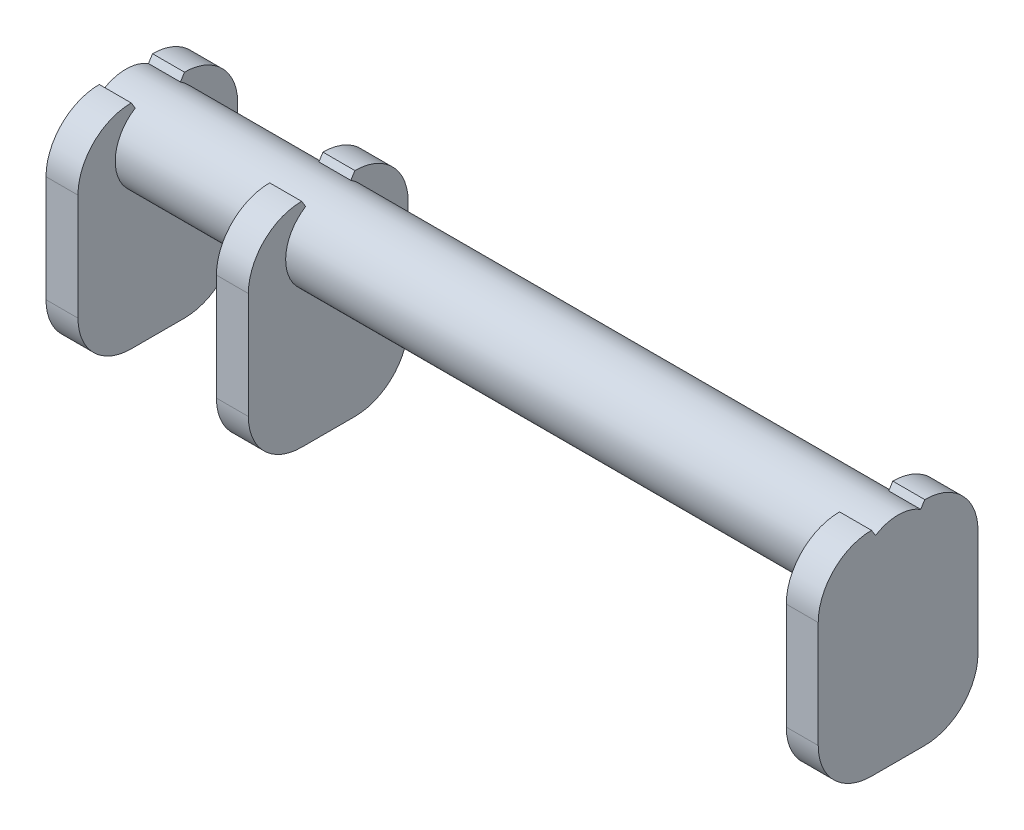
ISO-10303-21;
HEADER;
FILE_DESCRIPTION(('STEP AP214'),'2;1');
FILE_NAME('part.step','',(''),(''),'','','');
FILE_SCHEMA(('AUTOMOTIVE_DESIGN { 1 0 10303 214 1 1 1 1 }'));
ENDSEC;
DATA;
#1=APPLICATION_CONTEXT('core data for automotive mechanical design processes');
#2=APPLICATION_PROTOCOL_DEFINITION('international standard','automotive_design',2000,#1);
#3=PRODUCT_CONTEXT('',#1,'mechanical');
#4=PRODUCT('Part','Part','',(#3));
#5=PRODUCT_RELATED_PRODUCT_CATEGORY('part','',(#4));
#6=PRODUCT_DEFINITION_FORMATION('','',#4);
#7=PRODUCT_DEFINITION_CONTEXT('part definition',#1,'design');
#8=PRODUCT_DEFINITION('design','',#6,#7);
#9=PRODUCT_DEFINITION_SHAPE('','',#8);
#10=(LENGTH_UNIT() NAMED_UNIT(*) SI_UNIT(.MILLI.,.METRE.));
#11=(NAMED_UNIT(*) PLANE_ANGLE_UNIT() SI_UNIT($,.RADIAN.));
#12=(NAMED_UNIT(*) SI_UNIT($,.STERADIAN.) SOLID_ANGLE_UNIT());
#13=UNCERTAINTY_MEASURE_WITH_UNIT(LENGTH_MEASURE(1.E-05),#10,'distance_accuracy_value','');
#14=(GEOMETRIC_REPRESENTATION_CONTEXT(3) GLOBAL_UNCERTAINTY_ASSIGNED_CONTEXT((#13)) GLOBAL_UNIT_ASSIGNED_CONTEXT((#10,
#11,#12)) REPRESENTATION_CONTEXT('',''));
#15=CARTESIAN_POINT('',(0.,0.,0.));
#16=DIRECTION('',(0.,0.,1.));
#17=DIRECTION('',(1.,0.,0.));
#18=AXIS2_PLACEMENT_3D('',#15,#16,#17);
#19=CARTESIAN_POINT('',(145.,0.,0.));
#20=DIRECTION('',(-1.,0.,0.));
#21=DIRECTION('',(0.,0.,1.));
#22=AXIS2_PLACEMENT_3D('',#19,#20,#21);
#23=CYLINDRICAL_SURFACE('',#22,8.);
#24=DIRECTION('',(-1.,0.,0.));
#25=VECTOR('',#24,1.);
#26=CARTESIAN_POINT('',(145.,6.7839864320407,4.23999152002544));
#27=LINE('',#26,#25);
#28=CARTESIAN_POINT('',(38.,6.7839864320407,4.23999152002544));
#29=VERTEX_POINT('',#28);
#30=CARTESIAN_POINT('',(32.,6.7839864320407,4.23999152002544));
#31=VERTEX_POINT('',#30);
#32=EDGE_CURVE('E732',#29,#31,#27,.T.);
#33=ORIENTED_EDGE('',*,*,#32,.F.);
#34=CARTESIAN_POINT('',(38.,0.,0.));
#35=DIRECTION('',(1.,0.,0.));
#36=DIRECTION('',(0.,0.,-1.));
#37=AXIS2_PLACEMENT_3D('',#34,#35,#36);
#38=CIRCLE('',#37,8.);
#39=CARTESIAN_POINT('',(38.,6.78398643204069,-4.23999152002546));
#40=VERTEX_POINT('',#39);
#41=EDGE_CURVE('E180',#29,#40,#38,.T.);
#42=ORIENTED_EDGE('',*,*,#41,.T.);
#43=DIRECTION('',(-1.,0.,0.));
#44=VECTOR('',#43,1.);
#45=CARTESIAN_POINT('',(145.,6.78398643204069,-4.23999152002546));
#46=LINE('',#45,#44);
#47=CARTESIAN_POINT('',(32.,6.78398643204069,-4.23999152002546));
#48=VERTEX_POINT('',#47);
#49=EDGE_CURVE('E398',#40,#48,#46,.T.);
#50=ORIENTED_EDGE('',*,*,#49,.T.);
#51=CARTESIAN_POINT('',(32.,0.,0.));
#52=DIRECTION('',(1.,0.,0.));
#53=DIRECTION('',(0.,0.,-1.));
#54=AXIS2_PLACEMENT_3D('',#51,#52,#53);
#55=CIRCLE('',#54,8.);
#56=EDGE_CURVE('E177',#31,#48,#55,.T.);
#57=ORIENTED_EDGE('',*,*,#56,.F.);
#58=EDGE_LOOP('',(#33,#42,#50,#57));
#59=FACE_BOUND('',#58,.T.);
#60=CARTESIAN_POINT('',(6.00000000000001,6.7839864320407,4.23999152002544));
#61=VERTEX_POINT('',#60);
#62=CARTESIAN_POINT('',(0.,6.7839864320407,4.23999152002544));
#63=VERTEX_POINT('',#62);
#64=EDGE_CURVE('E733',#61,#63,#27,.T.);
#65=ORIENTED_EDGE('',*,*,#64,.F.);
#66=CARTESIAN_POINT('',(6.00000000000001,0.,0.));
#67=DIRECTION('',(1.,0.,0.));
#68=DIRECTION('',(0.,0.,-1.));
#69=AXIS2_PLACEMENT_3D('',#66,#67,#68);
#70=CIRCLE('',#69,8.);
#71=CARTESIAN_POINT('',(6.00000000000001,6.78398643204069,-4.23999152002546));
#72=VERTEX_POINT('',#71);
#73=EDGE_CURVE('E164',#61,#72,#70,.T.);
#74=ORIENTED_EDGE('',*,*,#73,.T.);
#75=CARTESIAN_POINT('',(0.,6.78398643204069,-4.23999152002546));
#76=VERTEX_POINT('',#75);
#77=EDGE_CURVE('E410',#72,#76,#46,.T.);
#78=ORIENTED_EDGE('',*,*,#77,.T.);
#79=CARTESIAN_POINT('',(0.,0.,0.));
#80=DIRECTION('',(1.,0.,0.));
#81=DIRECTION('',(0.,0.,1.));
#82=AXIS2_PLACEMENT_3D('',#79,#80,#81);
#83=CIRCLE('',#82,8.);
#84=EDGE_CURVE('E754',#76,#63,#83,.T.);
#85=ORIENTED_EDGE('',*,*,#84,.T.);
#86=EDGE_LOOP('',(#65,#74,#78,#85));
#87=FACE_BOUND('',#86,.T.);
#88=CARTESIAN_POINT('',(139.,0.,0.));
#89=DIRECTION('',(1.,0.,0.));
#90=DIRECTION('',(0.,0.,-1.));
#91=AXIS2_PLACEMENT_3D('',#88,#89,#90);
#92=CIRCLE('',#91,8.);
#93=CARTESIAN_POINT('',(139.,6.7839864320407,4.23999152002544));
#94=VERTEX_POINT('',#93);
#95=CARTESIAN_POINT('',(139.,6.78398643204069,-4.23999152002546));
#96=VERTEX_POINT('',#95);
#97=EDGE_CURVE('E48',#94,#96,#92,.T.);
#98=ORIENTED_EDGE('',*,*,#97,.F.);
#99=CARTESIAN_POINT('',(145.,6.7839864320407,4.23999152002544));
#100=VERTEX_POINT('',#99);
#101=EDGE_CURVE('E203',#100,#94,#27,.T.);
#102=ORIENTED_EDGE('',*,*,#101,.F.);
#103=CARTESIAN_POINT('',(145.,0.,0.));
#104=DIRECTION('',(1.,0.,0.));
#105=DIRECTION('',(0.,0.,-1.));
#106=AXIS2_PLACEMENT_3D('',#103,#104,#105);
#107=CIRCLE('',#106,8.);
#108=CARTESIAN_POINT('',(145.,6.78398643204069,-4.23999152002547));
#109=VERTEX_POINT('',#108);
#110=EDGE_CURVE('E11',#100,#109,#107,.F.);
#111=ORIENTED_EDGE('',*,*,#110,.T.);
#112=EDGE_CURVE('E205',#109,#96,#46,.T.);
#113=ORIENTED_EDGE('',*,*,#112,.T.);
#114=EDGE_LOOP('',(#98,#102,#111,#113));
#115=FACE_BOUND('',#114,.T.);
#116=ADVANCED_FACE('F41',(#59,#87,#115),#23,.T.);
#117=CARTESIAN_POINT('',(6.,-22.,5.));
#118=DIRECTION('',(-1.,0.,0.));
#119=DIRECTION('',(0.,0.,1.));
#120=AXIS2_PLACEMENT_3D('',#117,#118,#119);
#121=CYLINDRICAL_SURFACE('',#120,10.);
#122=CARTESIAN_POINT('',(0.,-22.,5.));
#123=DIRECTION('',(-1.,0.,0.));
#124=DIRECTION('',(0.,0.,-1.));
#125=AXIS2_PLACEMENT_3D('',#122,#123,#124);
#126=CIRCLE('',#125,10.);
#127=CARTESIAN_POINT('',(0.,-32.,5.));
#128=VERTEX_POINT('',#127);
#129=CARTESIAN_POINT('',(0.,-22.,15.));
#130=VERTEX_POINT('',#129);
#131=EDGE_CURVE('E143',#128,#130,#126,.T.);
#132=ORIENTED_EDGE('',*,*,#131,.F.);
#133=DIRECTION('',(-1.,0.,0.));
#134=VECTOR('',#133,1.);
#135=CARTESIAN_POINT('',(6.,-32.,5.));
#136=LINE('',#135,#134);
#137=CARTESIAN_POINT('',(6.,-32.,5.));
#138=VERTEX_POINT('',#137);
#139=EDGE_CURVE('E62',#138,#128,#136,.T.);
#140=ORIENTED_EDGE('',*,*,#139,.F.);
#141=CARTESIAN_POINT('',(6.,-22.,5.));
#142=DIRECTION('',(-1.,0.,0.));
#143=DIRECTION('',(0.,0.,-1.));
#144=AXIS2_PLACEMENT_3D('',#141,#142,#143);
#145=CIRCLE('',#144,10.);
#146=CARTESIAN_POINT('',(6.,-22.,15.));
#147=VERTEX_POINT('',#146);
#148=EDGE_CURVE('E162',#138,#147,#145,.T.);
#149=ORIENTED_EDGE('',*,*,#148,.T.);
#150=DIRECTION('',(-1.,0.,0.));
#151=VECTOR('',#150,1.);
#152=CARTESIAN_POINT('',(6.,-22.,15.));
#153=LINE('',#152,#151);
#154=EDGE_CURVE('E98',#147,#130,#153,.T.);
#155=ORIENTED_EDGE('',*,*,#154,.T.);
#156=EDGE_LOOP('',(#132,#140,#149,#155));
#157=FACE_BOUND('',#156,.T.);
#158=ADVANCED_FACE('F371',(#157),#121,.T.);
#159=CARTESIAN_POINT('',(6.,-32.,5.));
#160=DIRECTION('',(0.,-1.,0.));
#161=DIRECTION('',(0.,0.,-1.));
#162=AXIS2_PLACEMENT_3D('',#159,#160,#161);
#163=PLANE('',#162);
#164=DIRECTION('',(0.,0.,1.));
#165=VECTOR('',#164,1.);
#166=CARTESIAN_POINT('',(0.,-32.,5.));
#167=LINE('',#166,#165);
#168=CARTESIAN_POINT('',(0.,-32.,-5.));
#169=VERTEX_POINT('',#168);
#170=EDGE_CURVE('E159',#169,#128,#167,.T.);
#171=ORIENTED_EDGE('',*,*,#170,.F.);
#172=DIRECTION('',(-1.,0.,0.));
#173=VECTOR('',#172,1.);
#174=CARTESIAN_POINT('',(6.,-32.,-5.));
#175=LINE('',#174,#173);
#176=CARTESIAN_POINT('',(6.,-32.,-5.));
#177=VERTEX_POINT('',#176);
#178=EDGE_CURVE('E123',#177,#169,#175,.T.);
#179=ORIENTED_EDGE('',*,*,#178,.F.);
#180=DIRECTION('',(0.,0.,1.));
#181=VECTOR('',#180,1.);
#182=CARTESIAN_POINT('',(6.,-32.,5.));
#183=LINE('',#182,#181);
#184=EDGE_CURVE('E133',#177,#138,#183,.T.);
#185=ORIENTED_EDGE('',*,*,#184,.T.);
#186=ORIENTED_EDGE('',*,*,#139,.T.);
#187=EDGE_LOOP('',(#171,#179,#185,#186));
#188=FACE_BOUND('',#187,.T.);
#189=ADVANCED_FACE('F372',(#188),#163,.T.);
#190=CARTESIAN_POINT('',(6.,-22.,-5.));
#191=DIRECTION('',(-1.,0.,0.));
#192=DIRECTION('',(0.,0.,1.));
#193=AXIS2_PLACEMENT_3D('',#190,#191,#192);
#194=CYLINDRICAL_SURFACE('',#193,10.);
#195=CARTESIAN_POINT('',(0.,-22.,-5.));
#196=DIRECTION('',(-1.,0.,0.));
#197=DIRECTION('',(0.,0.,1.));
#198=AXIS2_PLACEMENT_3D('',#195,#196,#197);
#199=CIRCLE('',#198,10.);
#200=CARTESIAN_POINT('',(0.,-22.,-15.));
#201=VERTEX_POINT('',#200);
#202=EDGE_CURVE('E118',#201,#169,#199,.T.);
#203=ORIENTED_EDGE('',*,*,#202,.F.);
#204=DIRECTION('',(-1.,0.,0.));
#205=VECTOR('',#204,1.);
#206=CARTESIAN_POINT('',(6.,-22.,-15.));
#207=LINE('',#206,#205);
#208=CARTESIAN_POINT('',(6.,-22.,-15.));
#209=VERTEX_POINT('',#208);
#210=EDGE_CURVE('E112',#209,#201,#207,.T.);
#211=ORIENTED_EDGE('',*,*,#210,.F.);
#212=CARTESIAN_POINT('',(6.,-22.,-5.));
#213=DIRECTION('',(-1.,0.,0.));
#214=DIRECTION('',(0.,0.,1.));
#215=AXIS2_PLACEMENT_3D('',#212,#213,#214);
#216=CIRCLE('',#215,10.);
#217=EDGE_CURVE('E115',#209,#177,#216,.T.);
#218=ORIENTED_EDGE('',*,*,#217,.T.);
#219=ORIENTED_EDGE('',*,*,#178,.T.);
#220=EDGE_LOOP('',(#203,#211,#218,#219));
#221=FACE_BOUND('',#220,.T.);
#222=ADVANCED_FACE('F114',(#221),#194,.T.);
#223=CARTESIAN_POINT('',(6.,-2.,-15.));
#224=DIRECTION('',(0.,0.,-1.));
#225=DIRECTION('',(0.,1.,0.));
#226=AXIS2_PLACEMENT_3D('',#223,#224,#225);
#227=PLANE('',#226);
#228=DIRECTION('',(0.,-1.,0.));
#229=VECTOR('',#228,1.);
#230=CARTESIAN_POINT('',(0.,-2.,-15.));
#231=LINE('',#230,#229);
#232=CARTESIAN_POINT('',(0.,-2.,-15.));
#233=VERTEX_POINT('',#232);
#234=EDGE_CURVE('E156',#233,#201,#231,.T.);
#235=ORIENTED_EDGE('',*,*,#234,.F.);
#236=DIRECTION('',(-1.,0.,0.));
#237=VECTOR('',#236,1.);
#238=CARTESIAN_POINT('',(6.,-2.,-15.));
#239=LINE('',#238,#237);
#240=CARTESIAN_POINT('',(6.,-2.,-15.));
#241=VERTEX_POINT('',#240);
#242=EDGE_CURVE('E124',#241,#233,#239,.T.);
#243=ORIENTED_EDGE('',*,*,#242,.F.);
#244=DIRECTION('',(0.,-1.,0.));
#245=VECTOR('',#244,1.);
#246=CARTESIAN_POINT('',(6.,-2.,-15.));
#247=LINE('',#246,#245);
#248=EDGE_CURVE('E131',#241,#209,#247,.T.);
#249=ORIENTED_EDGE('',*,*,#248,.T.);
#250=ORIENTED_EDGE('',*,*,#210,.T.);
#251=EDGE_LOOP('',(#235,#243,#249,#250));
#252=FACE_BOUND('',#251,.T.);
#253=ADVANCED_FACE('F135',(#252),#227,.T.);
#254=CARTESIAN_POINT('',(6.,-2.,-5.));
#255=DIRECTION('',(-1.,0.,0.));
#256=DIRECTION('',(0.,0.,1.));
#257=AXIS2_PLACEMENT_3D('',#254,#255,#256);
#258=CYLINDRICAL_SURFACE('',#257,10.);
#259=CARTESIAN_POINT('',(0.,-2.,-5.));
#260=DIRECTION('',(-1.,0.,0.));
#261=DIRECTION('',(0.,0.,1.));
#262=AXIS2_PLACEMENT_3D('',#259,#260,#261);
#263=CIRCLE('',#262,10.);
#264=CARTESIAN_POINT('',(0.,8.,-5.));
#265=VERTEX_POINT('',#264);
#266=EDGE_CURVE('E153',#265,#233,#263,.T.);
#267=ORIENTED_EDGE('',*,*,#266,.F.);
#268=DIRECTION('',(-1.,0.,0.));
#269=VECTOR('',#268,1.);
#270=CARTESIAN_POINT('',(6.,8.,-5.));
#271=LINE('',#270,#269);
#272=CARTESIAN_POINT('',(6.00000000000001,8.,-5.00000000000003));
#273=VERTEX_POINT('',#272);
#274=EDGE_CURVE('E167',#273,#265,#271,.T.);
#275=ORIENTED_EDGE('',*,*,#274,.F.);
#276=CARTESIAN_POINT('',(6.,-2.,-5.));
#277=DIRECTION('',(-1.,0.,0.));
#278=DIRECTION('',(0.,0.,1.));
#279=AXIS2_PLACEMENT_3D('',#276,#277,#278);
#280=CIRCLE('',#279,10.);
#281=EDGE_CURVE('E136',#273,#241,#280,.T.);
#282=ORIENTED_EDGE('',*,*,#281,.T.);
#283=ORIENTED_EDGE('',*,*,#242,.T.);
#284=EDGE_LOOP('',(#267,#275,#282,#283));
#285=FACE_BOUND('',#284,.T.);
#286=ADVANCED_FACE('F380',(#285),#258,.T.);
#287=CARTESIAN_POINT('',(6.,-2.,5.));
#288=DIRECTION('',(-1.,0.,0.));
#289=DIRECTION('',(0.,0.,1.));
#290=AXIS2_PLACEMENT_3D('',#287,#288,#289);
#291=CYLINDRICAL_SURFACE('',#290,10.);
#292=CARTESIAN_POINT('',(0.,-2.,5.));
#293=DIRECTION('',(-1.,0.,0.));
#294=DIRECTION('',(0.,0.,-1.));
#295=AXIS2_PLACEMENT_3D('',#292,#293,#294);
#296=CIRCLE('',#295,10.);
#297=CARTESIAN_POINT('',(0.,-2.,15.));
#298=VERTEX_POINT('',#297);
#299=CARTESIAN_POINT('',(0.,8.,5.));
#300=VERTEX_POINT('',#299);
#301=EDGE_CURVE('E150',#298,#300,#296,.T.);
#302=ORIENTED_EDGE('',*,*,#301,.F.);
#303=DIRECTION('',(-1.,0.,0.));
#304=VECTOR('',#303,1.);
#305=CARTESIAN_POINT('',(6.,-2.,15.));
#306=LINE('',#305,#304);
#307=CARTESIAN_POINT('',(6.,-2.,15.));
#308=VERTEX_POINT('',#307);
#309=EDGE_CURVE('E172',#308,#298,#306,.T.);
#310=ORIENTED_EDGE('',*,*,#309,.F.);
#311=CARTESIAN_POINT('',(6.,-2.,5.));
#312=DIRECTION('',(-1.,0.,0.));
#313=DIRECTION('',(0.,0.,-1.));
#314=AXIS2_PLACEMENT_3D('',#311,#312,#313);
#315=CIRCLE('',#314,10.);
#316=CARTESIAN_POINT('',(6.00000000000001,8.,5.));
#317=VERTEX_POINT('',#316);
#318=EDGE_CURVE('E138',#308,#317,#315,.T.);
#319=ORIENTED_EDGE('',*,*,#318,.T.);
#320=DIRECTION('',(-1.,0.,0.));
#321=VECTOR('',#320,1.);
#322=CARTESIAN_POINT('',(6.,8.,5.));
#323=LINE('',#322,#321);
#324=EDGE_CURVE('E169',#317,#300,#323,.T.);
#325=ORIENTED_EDGE('',*,*,#324,.T.);
#326=EDGE_LOOP('',(#302,#310,#319,#325));
#327=FACE_BOUND('',#326,.T.);
#328=ADVANCED_FACE('F363',(#327),#291,.T.);
#329=CARTESIAN_POINT('',(6.,-2.,15.));
#330=DIRECTION('',(0.,0.,1.));
#331=DIRECTION('',(0.,-1.,0.));
#332=AXIS2_PLACEMENT_3D('',#329,#330,#331);
#333=PLANE('',#332);
#334=DIRECTION('',(0.,1.,0.));
#335=VECTOR('',#334,1.);
#336=CARTESIAN_POINT('',(0.,-2.,15.));
#337=LINE('',#336,#335);
#338=EDGE_CURVE('E146',#130,#298,#337,.T.);
#339=ORIENTED_EDGE('',*,*,#338,.F.);
#340=ORIENTED_EDGE('',*,*,#154,.F.);
#341=DIRECTION('',(0.,1.,0.));
#342=VECTOR('',#341,1.);
#343=CARTESIAN_POINT('',(6.,-2.,15.));
#344=LINE('',#343,#342);
#345=EDGE_CURVE('E358',#147,#308,#344,.T.);
#346=ORIENTED_EDGE('',*,*,#345,.T.);
#347=ORIENTED_EDGE('',*,*,#309,.T.);
#348=EDGE_LOOP('',(#339,#340,#346,#347));
#349=FACE_BOUND('',#348,.T.);
#350=ADVANCED_FACE('F367',(#349),#333,.T.);
#351=CARTESIAN_POINT('',(6.,-22.,5.));
#352=DIRECTION('',(1.,0.,0.));
#353=DIRECTION('',(0.,0.,-1.));
#354=AXIS2_PLACEMENT_3D('',#351,#352,#353);
#355=PLANE('',#354);
#356=DIRECTION('',(0.,-0.847998304005088,-0.52999894000318));
#357=VECTOR('',#356,1.);
#358=CARTESIAN_POINT('',(6.,-13.5730337078652,-8.48314606741573));
#359=LINE('',#358,#357);
#360=EDGE_CURVE('E366',#317,#61,#359,.T.);
#361=ORIENTED_EDGE('',*,*,#360,.F.);
#362=ORIENTED_EDGE('',*,*,#318,.F.);
#363=ORIENTED_EDGE('',*,*,#345,.F.);
#364=ORIENTED_EDGE('',*,*,#148,.F.);
#365=ORIENTED_EDGE('',*,*,#184,.F.);
#366=ORIENTED_EDGE('',*,*,#217,.F.);
#367=ORIENTED_EDGE('',*,*,#248,.F.);
#368=ORIENTED_EDGE('',*,*,#281,.F.);
#369=DIRECTION('',(0.,0.847998304005086,-0.529998940003183));
#370=VECTOR('',#369,1.);
#371=CARTESIAN_POINT('',(6.,-18.067415730337,11.2921348314607));
#372=LINE('',#371,#370);
#373=EDGE_CURVE('E383',#72,#273,#372,.T.);
#374=ORIENTED_EDGE('',*,*,#373,.F.);
#375=ORIENTED_EDGE('',*,*,#73,.F.);
#376=EDGE_LOOP('',(#361,#362,#363,#364,#365,#366,#367,#368,#374,#375));
#377=FACE_BOUND('',#376,.T.);
#378=ADVANCED_FACE('F129',(#377),#355,.T.);
#379=CARTESIAN_POINT('',(0.,0.,0.));
#380=DIRECTION('',(1.,0.,0.));
#381=DIRECTION('',(0.,0.,-1.));
#382=AXIS2_PLACEMENT_3D('',#379,#380,#381);
#383=PLANE('',#382);
#384=ORIENTED_EDGE('',*,*,#301,.T.);
#385=DIRECTION('',(0.,0.847998304005088,0.52999894000318));
#386=VECTOR('',#385,1.);
#387=CARTESIAN_POINT('',(0.,8.,5.));
#388=LINE('',#387,#386);
#389=EDGE_CURVE('E737',#63,#300,#388,.T.);
#390=ORIENTED_EDGE('',*,*,#389,.F.);
#391=ORIENTED_EDGE('',*,*,#84,.F.);
#392=DIRECTION('',(0.,-0.847998304005086,0.529998940003183));
#393=VECTOR('',#392,1.);
#394=CARTESIAN_POINT('',(0.,8.,-5.00000000000003));
#395=LINE('',#394,#393);
#396=EDGE_CURVE('E377',#265,#76,#395,.T.);
#397=ORIENTED_EDGE('',*,*,#396,.F.);
#398=ORIENTED_EDGE('',*,*,#266,.T.);
#399=ORIENTED_EDGE('',*,*,#234,.T.);
#400=ORIENTED_EDGE('',*,*,#202,.T.);
#401=ORIENTED_EDGE('',*,*,#170,.T.);
#402=ORIENTED_EDGE('',*,*,#131,.T.);
#403=ORIENTED_EDGE('',*,*,#338,.T.);
#404=EDGE_LOOP('',(#384,#390,#391,#397,#398,#399,#400,#401,#402,#403));
#405=FACE_BOUND('',#404,.T.);
#406=ADVANCED_FACE('F370',(#405),#383,.F.);
#407=CARTESIAN_POINT('',(38.,-22.,5.));
#408=DIRECTION('',(-1.,0.,0.));
#409=DIRECTION('',(0.,0.,1.));
#410=AXIS2_PLACEMENT_3D('',#407,#408,#409);
#411=CYLINDRICAL_SURFACE('',#410,10.);
#412=CARTESIAN_POINT('',(32.,-22.,5.));
#413=DIRECTION('',(-1.,0.,0.));
#414=DIRECTION('',(0.,0.,-1.));
#415=AXIS2_PLACEMENT_3D('',#412,#413,#414);
#416=CIRCLE('',#415,10.);
#417=CARTESIAN_POINT('',(32.,-32.,5.));
#418=VERTEX_POINT('',#417);
#419=CARTESIAN_POINT('',(32.,-22.,15.));
#420=VERTEX_POINT('',#419);
#421=EDGE_CURVE('E323',#418,#420,#416,.T.);
#422=ORIENTED_EDGE('',*,*,#421,.F.);
#423=DIRECTION('',(-1.,0.,0.));
#424=VECTOR('',#423,1.);
#425=CARTESIAN_POINT('',(38.,-32.,5.));
#426=LINE('',#425,#424);
#427=CARTESIAN_POINT('',(38.,-32.,5.));
#428=VERTEX_POINT('',#427);
#429=EDGE_CURVE('E147',#428,#418,#426,.T.);
#430=ORIENTED_EDGE('',*,*,#429,.F.);
#431=CARTESIAN_POINT('',(38.,-22.,5.));
#432=DIRECTION('',(-1.,0.,0.));
#433=DIRECTION('',(0.,0.,-1.));
#434=AXIS2_PLACEMENT_3D('',#431,#432,#433);
#435=CIRCLE('',#434,10.);
#436=CARTESIAN_POINT('',(38.,-22.,15.));
#437=VERTEX_POINT('',#436);
#438=EDGE_CURVE('E336',#428,#437,#435,.T.);
#439=ORIENTED_EDGE('',*,*,#438,.T.);
#440=DIRECTION('',(-1.,0.,0.));
#441=VECTOR('',#440,1.);
#442=CARTESIAN_POINT('',(38.,-22.,15.));
#443=LINE('',#442,#441);
#444=EDGE_CURVE('E325',#437,#420,#443,.T.);
#445=ORIENTED_EDGE('',*,*,#444,.T.);
#446=EDGE_LOOP('',(#422,#430,#439,#445));
#447=FACE_BOUND('',#446,.T.);
#448=ADVANCED_FACE('F324',(#447),#411,.T.);
#449=CARTESIAN_POINT('',(38.,-32.,5.));
#450=DIRECTION('',(0.,-1.,0.));
#451=DIRECTION('',(0.,0.,-1.));
#452=AXIS2_PLACEMENT_3D('',#449,#450,#451);
#453=PLANE('',#452);
#454=DIRECTION('',(0.,0.,1.));
#455=VECTOR('',#454,1.);
#456=CARTESIAN_POINT('',(32.,-32.,5.));
#457=LINE('',#456,#455);
#458=CARTESIAN_POINT('',(32.,-32.,-5.));
#459=VERTEX_POINT('',#458);
#460=EDGE_CURVE('E315',#459,#418,#457,.T.);
#461=ORIENTED_EDGE('',*,*,#460,.F.);
#462=DIRECTION('',(-1.,0.,0.));
#463=VECTOR('',#462,1.);
#464=CARTESIAN_POINT('',(38.,-32.,-5.));
#465=LINE('',#464,#463);
#466=CARTESIAN_POINT('',(38.,-32.,-5.));
#467=VERTEX_POINT('',#466);
#468=EDGE_CURVE('E306',#467,#459,#465,.T.);
#469=ORIENTED_EDGE('',*,*,#468,.F.);
#470=DIRECTION('',(0.,0.,1.));
#471=VECTOR('',#470,1.);
#472=CARTESIAN_POINT('',(38.,-32.,5.));
#473=LINE('',#472,#471);
#474=EDGE_CURVE('E317',#467,#428,#473,.T.);
#475=ORIENTED_EDGE('',*,*,#474,.T.);
#476=ORIENTED_EDGE('',*,*,#429,.T.);
#477=EDGE_LOOP('',(#461,#469,#475,#476));
#478=FACE_BOUND('',#477,.T.);
#479=ADVANCED_FACE('F313',(#478),#453,.T.);
#480=CARTESIAN_POINT('',(38.,-22.,-5.));
#481=DIRECTION('',(-1.,0.,0.));
#482=DIRECTION('',(0.,0.,1.));
#483=AXIS2_PLACEMENT_3D('',#480,#481,#482);
#484=CYLINDRICAL_SURFACE('',#483,10.);
#485=CARTESIAN_POINT('',(32.,-22.,-5.));
#486=DIRECTION('',(-1.,0.,0.));
#487=DIRECTION('',(0.,0.,1.));
#488=AXIS2_PLACEMENT_3D('',#485,#486,#487);
#489=CIRCLE('',#488,10.);
#490=CARTESIAN_POINT('',(32.,-22.,-15.));
#491=VERTEX_POINT('',#490);
#492=EDGE_CURVE('E335',#491,#459,#489,.T.);
#493=ORIENTED_EDGE('',*,*,#492,.F.);
#494=DIRECTION('',(-1.,0.,0.));
#495=VECTOR('',#494,1.);
#496=CARTESIAN_POINT('',(38.,-22.,-15.));
#497=LINE('',#496,#495);
#498=CARTESIAN_POINT('',(38.,-22.,-15.));
#499=VERTEX_POINT('',#498);
#500=EDGE_CURVE('E345',#499,#491,#497,.T.);
#501=ORIENTED_EDGE('',*,*,#500,.F.);
#502=CARTESIAN_POINT('',(38.,-22.,-5.));
#503=DIRECTION('',(-1.,0.,0.));
#504=DIRECTION('',(0.,0.,1.));
#505=AXIS2_PLACEMENT_3D('',#502,#503,#504);
#506=CIRCLE('',#505,10.);
#507=EDGE_CURVE('E492',#499,#467,#506,.T.);
#508=ORIENTED_EDGE('',*,*,#507,.T.);
#509=ORIENTED_EDGE('',*,*,#468,.T.);
#510=EDGE_LOOP('',(#493,#501,#508,#509));
#511=FACE_BOUND('',#510,.T.);
#512=ADVANCED_FACE('F503',(#511),#484,.T.);
#513=CARTESIAN_POINT('',(38.,-2.,-15.));
#514=DIRECTION('',(0.,0.,-1.));
#515=DIRECTION('',(0.,1.,0.));
#516=AXIS2_PLACEMENT_3D('',#513,#514,#515);
#517=PLANE('',#516);
#518=DIRECTION('',(0.,-1.,0.));
#519=VECTOR('',#518,1.);
#520=CARTESIAN_POINT('',(32.,-2.,-15.));
#521=LINE('',#520,#519);
#522=CARTESIAN_POINT('',(32.,-2.,-15.));
#523=VERTEX_POINT('',#522);
#524=EDGE_CURVE('E340',#523,#491,#521,.T.);
#525=ORIENTED_EDGE('',*,*,#524,.F.);
#526=DIRECTION('',(-1.,0.,0.));
#527=VECTOR('',#526,1.);
#528=CARTESIAN_POINT('',(38.,-2.,-15.));
#529=LINE('',#528,#527);
#530=CARTESIAN_POINT('',(38.,-2.,-15.));
#531=VERTEX_POINT('',#530);
#532=EDGE_CURVE('E347',#531,#523,#529,.T.);
#533=ORIENTED_EDGE('',*,*,#532,.F.);
#534=DIRECTION('',(0.,-1.,0.));
#535=VECTOR('',#534,1.);
#536=CARTESIAN_POINT('',(38.,-2.,-15.));
#537=LINE('',#536,#535);
#538=EDGE_CURVE('E489',#531,#499,#537,.T.);
#539=ORIENTED_EDGE('',*,*,#538,.T.);
#540=ORIENTED_EDGE('',*,*,#500,.T.);
#541=EDGE_LOOP('',(#525,#533,#539,#540));
#542=FACE_BOUND('',#541,.T.);
#543=ADVANCED_FACE('F500',(#542),#517,.T.);
#544=CARTESIAN_POINT('',(38.,-2.,-5.));
#545=DIRECTION('',(-1.,0.,0.));
#546=DIRECTION('',(0.,0.,1.));
#547=AXIS2_PLACEMENT_3D('',#544,#545,#546);
#548=CYLINDRICAL_SURFACE('',#547,10.);
#549=CARTESIAN_POINT('',(32.,-2.,-5.));
#550=DIRECTION('',(-1.,0.,0.));
#551=DIRECTION('',(0.,0.,1.));
#552=AXIS2_PLACEMENT_3D('',#549,#550,#551);
#553=CIRCLE('',#552,10.);
#554=CARTESIAN_POINT('',(32.,8.,-5.));
#555=VERTEX_POINT('',#554);
#556=EDGE_CURVE('E497',#555,#523,#553,.T.);
#557=ORIENTED_EDGE('',*,*,#556,.F.);
#558=DIRECTION('',(-1.,0.,0.));
#559=VECTOR('',#558,1.);
#560=CARTESIAN_POINT('',(38.,8.,-5.));
#561=LINE('',#560,#559);
#562=CARTESIAN_POINT('',(38.,8.,-5.00000000000003));
#563=VERTEX_POINT('',#562);
#564=EDGE_CURVE('E349',#563,#555,#561,.T.);
#565=ORIENTED_EDGE('',*,*,#564,.F.);
#566=CARTESIAN_POINT('',(38.,-2.,-5.));
#567=DIRECTION('',(-1.,0.,0.));
#568=DIRECTION('',(0.,0.,1.));
#569=AXIS2_PLACEMENT_3D('',#566,#567,#568);
#570=CIRCLE('',#569,10.);
#571=EDGE_CURVE('E486',#563,#531,#570,.T.);
#572=ORIENTED_EDGE('',*,*,#571,.T.);
#573=ORIENTED_EDGE('',*,*,#532,.T.);
#574=EDGE_LOOP('',(#557,#565,#572,#573));
#575=FACE_BOUND('',#574,.T.);
#576=ADVANCED_FACE('F510',(#575),#548,.T.);
#577=CARTESIAN_POINT('',(38.,-2.,5.));
#578=DIRECTION('',(-1.,0.,0.));
#579=DIRECTION('',(0.,0.,1.));
#580=AXIS2_PLACEMENT_3D('',#577,#578,#579);
#581=CYLINDRICAL_SURFACE('',#580,10.);
#582=CARTESIAN_POINT('',(32.,-2.,5.));
#583=DIRECTION('',(-1.,0.,0.));
#584=DIRECTION('',(0.,0.,-1.));
#585=AXIS2_PLACEMENT_3D('',#582,#583,#584);
#586=CIRCLE('',#585,10.);
#587=CARTESIAN_POINT('',(32.,-2.,15.));
#588=VERTEX_POINT('',#587);
#589=CARTESIAN_POINT('',(32.,8.,5.));
#590=VERTEX_POINT('',#589);
#591=EDGE_CURVE('E415',#588,#590,#586,.T.);
#592=ORIENTED_EDGE('',*,*,#591,.F.);
#593=DIRECTION('',(-1.,0.,0.));
#594=VECTOR('',#593,1.);
#595=CARTESIAN_POINT('',(38.,-2.,15.));
#596=LINE('',#595,#594);
#597=CARTESIAN_POINT('',(38.,-2.,15.));
#598=VERTEX_POINT('',#597);
#599=EDGE_CURVE('E354',#598,#588,#596,.T.);
#600=ORIENTED_EDGE('',*,*,#599,.F.);
#601=CARTESIAN_POINT('',(38.,-2.,5.));
#602=DIRECTION('',(-1.,0.,0.));
#603=DIRECTION('',(0.,0.,-1.));
#604=AXIS2_PLACEMENT_3D('',#601,#602,#603);
#605=CIRCLE('',#604,10.);
#606=CARTESIAN_POINT('',(38.,8.,5.));
#607=VERTEX_POINT('',#606);
#608=EDGE_CURVE('E483',#598,#607,#605,.T.);
#609=ORIENTED_EDGE('',*,*,#608,.T.);
#610=DIRECTION('',(-1.,0.,0.));
#611=VECTOR('',#610,1.);
#612=CARTESIAN_POINT('',(38.,8.,5.));
#613=LINE('',#612,#611);
#614=EDGE_CURVE('E351',#607,#590,#613,.T.);
#615=ORIENTED_EDGE('',*,*,#614,.T.);
#616=EDGE_LOOP('',(#592,#600,#609,#615));
#617=FACE_BOUND('',#616,.T.);
#618=ADVANCED_FACE('F706',(#617),#581,.T.);
#619=CARTESIAN_POINT('',(38.,-2.,15.));
#620=DIRECTION('',(0.,0.,1.));
#621=DIRECTION('',(0.,-1.,0.));
#622=AXIS2_PLACEMENT_3D('',#619,#620,#621);
#623=PLANE('',#622);
#624=DIRECTION('',(0.,1.,0.));
#625=VECTOR('',#624,1.);
#626=CARTESIAN_POINT('',(32.,-2.,15.));
#627=LINE('',#626,#625);
#628=EDGE_CURVE('E329',#420,#588,#627,.T.);
#629=ORIENTED_EDGE('',*,*,#628,.F.);
#630=ORIENTED_EDGE('',*,*,#444,.F.);
#631=DIRECTION('',(0.,1.,0.));
#632=VECTOR('',#631,1.);
#633=CARTESIAN_POINT('',(38.,-2.,15.));
#634=LINE('',#633,#632);
#635=EDGE_CURVE('E338',#437,#598,#634,.T.);
#636=ORIENTED_EDGE('',*,*,#635,.T.);
#637=ORIENTED_EDGE('',*,*,#599,.T.);
#638=EDGE_LOOP('',(#629,#630,#636,#637));
#639=FACE_BOUND('',#638,.T.);
#640=ADVANCED_FACE('F665',(#639),#623,.T.);
#641=CARTESIAN_POINT('',(38.,-22.,5.));
#642=DIRECTION('',(1.,0.,0.));
#643=DIRECTION('',(0.,0.,-1.));
#644=AXIS2_PLACEMENT_3D('',#641,#642,#643);
#645=PLANE('',#644);
#646=DIRECTION('',(0.,-0.847998304005088,-0.52999894000318));
#647=VECTOR('',#646,1.);
#648=CARTESIAN_POINT('',(38.,-13.5730337078652,-8.48314606741573));
#649=LINE('',#648,#647);
#650=EDGE_CURVE('E417',#607,#29,#649,.T.);
#651=ORIENTED_EDGE('',*,*,#650,.F.);
#652=ORIENTED_EDGE('',*,*,#608,.F.);
#653=ORIENTED_EDGE('',*,*,#635,.F.);
#654=ORIENTED_EDGE('',*,*,#438,.F.);
#655=ORIENTED_EDGE('',*,*,#474,.F.);
#656=ORIENTED_EDGE('',*,*,#507,.F.);
#657=ORIENTED_EDGE('',*,*,#538,.F.);
#658=ORIENTED_EDGE('',*,*,#571,.F.);
#659=DIRECTION('',(0.,0.847998304005086,-0.529998940003183));
#660=VECTOR('',#659,1.);
#661=CARTESIAN_POINT('',(38.,-18.067415730337,11.2921348314607));
#662=LINE('',#661,#660);
#663=EDGE_CURVE('E403',#40,#563,#662,.T.);
#664=ORIENTED_EDGE('',*,*,#663,.F.);
#665=ORIENTED_EDGE('',*,*,#41,.F.);
#666=EDGE_LOOP('',(#651,#652,#653,#654,#655,#656,#657,#658,#664,#665));
#667=FACE_BOUND('',#666,.T.);
#668=ADVANCED_FACE('F662',(#667),#645,.T.);
#669=CARTESIAN_POINT('',(32.,-22.,5.));
#670=DIRECTION('',(1.,0.,0.));
#671=DIRECTION('',(0.,0.,-1.));
#672=AXIS2_PLACEMENT_3D('',#669,#670,#671);
#673=PLANE('',#672);
#674=ORIENTED_EDGE('',*,*,#591,.T.);
#675=DIRECTION('',(0.,-0.847998304005088,-0.52999894000318));
#676=VECTOR('',#675,1.);
#677=CARTESIAN_POINT('',(32.,-13.5730337078652,-8.48314606741573));
#678=LINE('',#677,#676);
#679=EDGE_CURVE('E413',#590,#31,#678,.T.);
#680=ORIENTED_EDGE('',*,*,#679,.T.);
#681=ORIENTED_EDGE('',*,*,#56,.T.);
#682=DIRECTION('',(0.,0.847998304005086,-0.529998940003183));
#683=VECTOR('',#682,1.);
#684=CARTESIAN_POINT('',(32.,-18.067415730337,11.2921348314607));
#685=LINE('',#684,#683);
#686=EDGE_CURVE('E395',#48,#555,#685,.T.);
#687=ORIENTED_EDGE('',*,*,#686,.T.);
#688=ORIENTED_EDGE('',*,*,#556,.T.);
#689=ORIENTED_EDGE('',*,*,#524,.T.);
#690=ORIENTED_EDGE('',*,*,#492,.T.);
#691=ORIENTED_EDGE('',*,*,#460,.T.);
#692=ORIENTED_EDGE('',*,*,#421,.T.);
#693=ORIENTED_EDGE('',*,*,#628,.T.);
#694=EDGE_LOOP('',(#674,#680,#681,#687,#688,#689,#690,#691,#692,#693));
#695=FACE_BOUND('',#694,.T.);
#696=ADVANCED_FACE('F333',(#695),#673,.F.);
#697=CARTESIAN_POINT('',(145.,-22.,5.));
#698=DIRECTION('',(-1.,0.,0.));
#699=DIRECTION('',(0.,0.,1.));
#700=AXIS2_PLACEMENT_3D('',#697,#698,#699);
#701=CYLINDRICAL_SURFACE('',#700,10.);
#702=CARTESIAN_POINT('',(139.,-22.,5.));
#703=DIRECTION('',(-1.,0.,0.));
#704=DIRECTION('',(0.,0.,-1.));
#705=AXIS2_PLACEMENT_3D('',#702,#703,#704);
#706=CIRCLE('',#705,10.);
#707=CARTESIAN_POINT('',(139.,-32.,5.));
#708=VERTEX_POINT('',#707);
#709=CARTESIAN_POINT('',(139.,-22.,15.));
#710=VERTEX_POINT('',#709);
#711=EDGE_CURVE('E424',#708,#710,#706,.T.);
#712=ORIENTED_EDGE('',*,*,#711,.F.);
#713=DIRECTION('',(-1.,0.,0.));
#714=VECTOR('',#713,1.);
#715=CARTESIAN_POINT('',(145.,-32.,5.));
#716=LINE('',#715,#714);
#717=CARTESIAN_POINT('',(145.,-32.,5.));
#718=VERTEX_POINT('',#717);
#719=EDGE_CURVE('E330',#718,#708,#716,.T.);
#720=ORIENTED_EDGE('',*,*,#719,.F.);
#721=CARTESIAN_POINT('',(145.,-22.,5.));
#722=DIRECTION('',(-1.,0.,0.));
#723=DIRECTION('',(0.,0.,-1.));
#724=AXIS2_PLACEMENT_3D('',#721,#722,#723);
#725=CIRCLE('',#724,10.);
#726=CARTESIAN_POINT('',(145.,-22.,15.));
#727=VERTEX_POINT('',#726);
#728=EDGE_CURVE('E425',#718,#727,#725,.T.);
#729=ORIENTED_EDGE('',*,*,#728,.T.);
#730=DIRECTION('',(-1.,0.,0.));
#731=VECTOR('',#730,1.);
#732=CARTESIAN_POINT('',(145.,-22.,15.));
#733=LINE('',#732,#731);
#734=EDGE_CURVE('E447',#727,#710,#733,.T.);
#735=ORIENTED_EDGE('',*,*,#734,.T.);
#736=EDGE_LOOP('',(#712,#720,#729,#735));
#737=FACE_BOUND('',#736,.T.);
#738=ADVANCED_FACE('F640',(#737),#701,.T.);
#739=CARTESIAN_POINT('',(145.,-32.,5.));
#740=DIRECTION('',(0.,-1.,0.));
#741=DIRECTION('',(0.,0.,-1.));
#742=AXIS2_PLACEMENT_3D('',#739,#740,#741);
#743=PLANE('',#742);
#744=DIRECTION('',(0.,0.,1.));
#745=VECTOR('',#744,1.);
#746=CARTESIAN_POINT('',(139.,-32.,5.));
#747=LINE('',#746,#745);
#748=CARTESIAN_POINT('',(139.,-32.,-5.));
#749=VERTEX_POINT('',#748);
#750=EDGE_CURVE('E429',#749,#708,#747,.T.);
#751=ORIENTED_EDGE('',*,*,#750,.F.);
#752=DIRECTION('',(-1.,0.,0.));
#753=VECTOR('',#752,1.);
#754=CARTESIAN_POINT('',(145.,-32.,-5.));
#755=LINE('',#754,#753);
#756=CARTESIAN_POINT('',(145.,-32.,-5.));
#757=VERTEX_POINT('',#756);
#758=EDGE_CURVE('E466',#757,#749,#755,.T.);
#759=ORIENTED_EDGE('',*,*,#758,.F.);
#760=DIRECTION('',(0.,0.,1.));
#761=VECTOR('',#760,1.);
#762=CARTESIAN_POINT('',(145.,-32.,5.));
#763=LINE('',#762,#761);
#764=EDGE_CURVE('E444',#757,#718,#763,.T.);
#765=ORIENTED_EDGE('',*,*,#764,.T.);
#766=ORIENTED_EDGE('',*,*,#719,.T.);
#767=EDGE_LOOP('',(#751,#759,#765,#766));
#768=FACE_BOUND('',#767,.T.);
#769=ADVANCED_FACE('F636',(#768),#743,.T.);
#770=CARTESIAN_POINT('',(145.,-22.,-5.));
#771=DIRECTION('',(-1.,0.,0.));
#772=DIRECTION('',(0.,0.,1.));
#773=AXIS2_PLACEMENT_3D('',#770,#771,#772);
#774=CYLINDRICAL_SURFACE('',#773,10.);
#775=CARTESIAN_POINT('',(139.,-22.,-5.));
#776=DIRECTION('',(-1.,0.,0.));
#777=DIRECTION('',(0.,0.,1.));
#778=AXIS2_PLACEMENT_3D('',#775,#776,#777);
#779=CIRCLE('',#778,10.);
#780=CARTESIAN_POINT('',(139.,-22.,-15.));
#781=VERTEX_POINT('',#780);
#782=EDGE_CURVE('E460',#781,#749,#779,.T.);
#783=ORIENTED_EDGE('',*,*,#782,.F.);
#784=DIRECTION('',(-1.,0.,0.));
#785=VECTOR('',#784,1.);
#786=CARTESIAN_POINT('',(145.,-22.,-15.));
#787=LINE('',#786,#785);
#788=CARTESIAN_POINT('',(145.,-22.,-15.));
#789=VERTEX_POINT('',#788);
#790=EDGE_CURVE('E468',#789,#781,#787,.T.);
#791=ORIENTED_EDGE('',*,*,#790,.F.);
#792=CARTESIAN_POINT('',(145.,-22.,-5.));
#793=DIRECTION('',(-1.,0.,0.));
#794=DIRECTION('',(0.,0.,1.));
#795=AXIS2_PLACEMENT_3D('',#792,#793,#794);
#796=CIRCLE('',#795,10.);
#797=EDGE_CURVE('E441',#789,#757,#796,.T.);
#798=ORIENTED_EDGE('',*,*,#797,.T.);
#799=ORIENTED_EDGE('',*,*,#758,.T.);
#800=EDGE_LOOP('',(#783,#791,#798,#799));
#801=FACE_BOUND('',#800,.T.);
#802=ADVANCED_FACE('F639',(#801),#774,.T.);
#803=CARTESIAN_POINT('',(145.,-2.,-15.));
#804=DIRECTION('',(0.,0.,-1.));
#805=DIRECTION('',(0.,1.,0.));
#806=AXIS2_PLACEMENT_3D('',#803,#804,#805);
#807=PLANE('',#806);
#808=DIRECTION('',(0.,-1.,0.));
#809=VECTOR('',#808,1.);
#810=CARTESIAN_POINT('',(139.,-2.,-15.));
#811=LINE('',#810,#809);
#812=CARTESIAN_POINT('',(139.,-2.,-15.));
#813=VERTEX_POINT('',#812);
#814=EDGE_CURVE('E457',#813,#781,#811,.T.);
#815=ORIENTED_EDGE('',*,*,#814,.F.);
#816=DIRECTION('',(-1.,0.,0.));
#817=VECTOR('',#816,1.);
#818=CARTESIAN_POINT('',(145.,-2.,-15.));
#819=LINE('',#818,#817);
#820=CARTESIAN_POINT('',(145.,-2.,-15.));
#821=VERTEX_POINT('',#820);
#822=EDGE_CURVE('E470',#821,#813,#819,.T.);
#823=ORIENTED_EDGE('',*,*,#822,.F.);
#824=DIRECTION('',(0.,-1.,0.));
#825=VECTOR('',#824,1.);
#826=CARTESIAN_POINT('',(145.,-2.,-15.));
#827=LINE('',#826,#825);
#828=EDGE_CURVE('E438',#821,#789,#827,.T.);
#829=ORIENTED_EDGE('',*,*,#828,.T.);
#830=ORIENTED_EDGE('',*,*,#790,.T.);
#831=EDGE_LOOP('',(#815,#823,#829,#830));
#832=FACE_BOUND('',#831,.T.);
#833=ADVANCED_FACE('F644',(#832),#807,.T.);
#834=CARTESIAN_POINT('',(145.,-2.,-5.));
#835=DIRECTION('',(-1.,0.,0.));
#836=DIRECTION('',(0.,0.,1.));
#837=AXIS2_PLACEMENT_3D('',#834,#835,#836);
#838=CYLINDRICAL_SURFACE('',#837,10.);
#839=CARTESIAN_POINT('',(139.,-2.,-5.));
#840=DIRECTION('',(-1.,0.,0.));
#841=DIRECTION('',(0.,0.,1.));
#842=AXIS2_PLACEMENT_3D('',#839,#840,#841);
#843=CIRCLE('',#842,10.);
#844=CARTESIAN_POINT('',(139.,8.,-5.00000000000003));
#845=VERTEX_POINT('',#844);
#846=EDGE_CURVE('E455',#845,#813,#843,.T.);
#847=ORIENTED_EDGE('',*,*,#846,.F.);
#848=DIRECTION('',(-1.,0.,0.));
#849=VECTOR('',#848,1.);
#850=CARTESIAN_POINT('',(145.,8.,-5.));
#851=LINE('',#850,#849);
#852=CARTESIAN_POINT('',(145.,8.,-5.00000000000003));
#853=VERTEX_POINT('',#852);
#854=EDGE_CURVE('E472',#853,#845,#851,.T.);
#855=ORIENTED_EDGE('',*,*,#854,.F.);
#856=CARTESIAN_POINT('',(145.,-2.,-5.));
#857=DIRECTION('',(-1.,0.,0.));
#858=DIRECTION('',(0.,0.,1.));
#859=AXIS2_PLACEMENT_3D('',#856,#857,#858);
#860=CIRCLE('',#859,10.);
#861=EDGE_CURVE('E435',#853,#821,#860,.T.);
#862=ORIENTED_EDGE('',*,*,#861,.T.);
#863=ORIENTED_EDGE('',*,*,#822,.T.);
#864=EDGE_LOOP('',(#847,#855,#862,#863));
#865=FACE_BOUND('',#864,.T.);
#866=ADVANCED_FACE('F648',(#865),#838,.T.);
#867=CARTESIAN_POINT('',(145.,-2.,5.));
#868=DIRECTION('',(-1.,0.,0.));
#869=DIRECTION('',(0.,0.,1.));
#870=AXIS2_PLACEMENT_3D('',#867,#868,#869);
#871=CYLINDRICAL_SURFACE('',#870,10.);
#872=CARTESIAN_POINT('',(139.,-2.,5.));
#873=DIRECTION('',(-1.,0.,0.));
#874=DIRECTION('',(0.,0.,-1.));
#875=AXIS2_PLACEMENT_3D('',#872,#873,#874);
#876=CIRCLE('',#875,10.);
#877=CARTESIAN_POINT('',(139.,-2.,15.));
#878=VERTEX_POINT('',#877);
#879=CARTESIAN_POINT('',(139.,8.,5.));
#880=VERTEX_POINT('',#879);
#881=EDGE_CURVE('E453',#878,#880,#876,.T.);
#882=ORIENTED_EDGE('',*,*,#881,.F.);
#883=DIRECTION('',(-1.,0.,0.));
#884=VECTOR('',#883,1.);
#885=CARTESIAN_POINT('',(145.,-2.,15.));
#886=LINE('',#885,#884);
#887=CARTESIAN_POINT('',(145.,-2.,15.));
#888=VERTEX_POINT('',#887);
#889=EDGE_CURVE('E478',#888,#878,#886,.T.);
#890=ORIENTED_EDGE('',*,*,#889,.F.);
#891=CARTESIAN_POINT('',(145.,-2.,5.));
#892=DIRECTION('',(-1.,0.,0.));
#893=DIRECTION('',(0.,0.,-1.));
#894=AXIS2_PLACEMENT_3D('',#891,#892,#893);
#895=CIRCLE('',#894,10.);
#896=CARTESIAN_POINT('',(145.,8.,5.));
#897=VERTEX_POINT('',#896);
#898=EDGE_CURVE('E432',#888,#897,#895,.T.);
#899=ORIENTED_EDGE('',*,*,#898,.T.);
#900=DIRECTION('',(-1.,0.,0.));
#901=VECTOR('',#900,1.);
#902=CARTESIAN_POINT('',(145.,8.,5.));
#903=LINE('',#902,#901);
#904=EDGE_CURVE('E475',#897,#880,#903,.T.);
#905=ORIENTED_EDGE('',*,*,#904,.T.);
#906=EDGE_LOOP('',(#882,#890,#899,#905));
#907=FACE_BOUND('',#906,.T.);
#908=ADVANCED_FACE('F652',(#907),#871,.T.);
#909=CARTESIAN_POINT('',(145.,-2.,15.));
#910=DIRECTION('',(0.,0.,1.));
#911=DIRECTION('',(0.,-1.,0.));
#912=AXIS2_PLACEMENT_3D('',#909,#910,#911);
#913=PLANE('',#912);
#914=DIRECTION('',(0.,1.,0.));
#915=VECTOR('',#914,1.);
#916=CARTESIAN_POINT('',(139.,-2.,15.));
#917=LINE('',#916,#915);
#918=EDGE_CURVE('E450',#710,#878,#917,.T.);
#919=ORIENTED_EDGE('',*,*,#918,.F.);
#920=ORIENTED_EDGE('',*,*,#734,.F.);
#921=DIRECTION('',(0.,1.,0.));
#922=VECTOR('',#921,1.);
#923=CARTESIAN_POINT('',(145.,-2.,15.));
#924=LINE('',#923,#922);
#925=EDGE_CURVE('E428',#727,#888,#924,.T.);
#926=ORIENTED_EDGE('',*,*,#925,.T.);
#927=ORIENTED_EDGE('',*,*,#889,.T.);
#928=EDGE_LOOP('',(#919,#920,#926,#927));
#929=FACE_BOUND('',#928,.T.);
#930=ADVANCED_FACE('F635',(#929),#913,.T.);
#931=CARTESIAN_POINT('',(139.,-22.,5.));
#932=DIRECTION('',(1.,0.,0.));
#933=DIRECTION('',(0.,0.,-1.));
#934=AXIS2_PLACEMENT_3D('',#931,#932,#933);
#935=PLANE('',#934);
#936=ORIENTED_EDGE('',*,*,#881,.T.);
#937=DIRECTION('',(0.,-0.847998304005088,-0.52999894000318));
#938=VECTOR('',#937,1.);
#939=CARTESIAN_POINT('',(139.,-13.5730337078652,-8.48314606741573));
#940=LINE('',#939,#938);
#941=EDGE_CURVE('E197',#880,#94,#940,.T.);
#942=ORIENTED_EDGE('',*,*,#941,.T.);
#943=ORIENTED_EDGE('',*,*,#97,.T.);
#944=DIRECTION('',(0.,0.847998304005086,-0.529998940003183));
#945=VECTOR('',#944,1.);
#946=CARTESIAN_POINT('',(139.,-18.067415730337,11.2921348314607));
#947=LINE('',#946,#945);
#948=EDGE_CURVE('E193',#96,#845,#947,.T.);
#949=ORIENTED_EDGE('',*,*,#948,.T.);
#950=ORIENTED_EDGE('',*,*,#846,.T.);
#951=ORIENTED_EDGE('',*,*,#814,.T.);
#952=ORIENTED_EDGE('',*,*,#782,.T.);
#953=ORIENTED_EDGE('',*,*,#750,.T.);
#954=ORIENTED_EDGE('',*,*,#711,.T.);
#955=ORIENTED_EDGE('',*,*,#918,.T.);
#956=EDGE_LOOP('',(#936,#942,#943,#949,#950,#951,#952,#953,#954,#955));
#957=FACE_BOUND('',#956,.T.);
#958=ADVANCED_FACE('F189',(#957),#935,.F.);
#959=CARTESIAN_POINT('',(145.,0.,0.));
#960=DIRECTION('',(1.,0.,0.));
#961=DIRECTION('',(0.,0.,-1.));
#962=AXIS2_PLACEMENT_3D('',#959,#960,#961);
#963=PLANE('',#962);
#964=DIRECTION('',(0.,0.847998304005088,0.52999894000318));
#965=VECTOR('',#964,1.);
#966=CARTESIAN_POINT('',(145.,8.,5.));
#967=LINE('',#966,#965);
#968=EDGE_CURVE('E743',#100,#897,#967,.T.);
#969=ORIENTED_EDGE('',*,*,#968,.T.);
#970=ORIENTED_EDGE('',*,*,#898,.F.);
#971=ORIENTED_EDGE('',*,*,#925,.F.);
#972=ORIENTED_EDGE('',*,*,#728,.F.);
#973=ORIENTED_EDGE('',*,*,#764,.F.);
#974=ORIENTED_EDGE('',*,*,#797,.F.);
#975=ORIENTED_EDGE('',*,*,#828,.F.);
#976=ORIENTED_EDGE('',*,*,#861,.F.);
#977=DIRECTION('',(0.,-0.847998304005086,0.529998940003183));
#978=VECTOR('',#977,1.);
#979=CARTESIAN_POINT('',(145.,8.,-5.00000000000003));
#980=LINE('',#979,#978);
#981=EDGE_CURVE('E747',#853,#109,#980,.T.);
#982=ORIENTED_EDGE('',*,*,#981,.T.);
#983=ORIENTED_EDGE('',*,*,#110,.F.);
#984=EDGE_LOOP('',(#969,#970,#971,#972,#973,#974,#975,#976,#982,#983));
#985=FACE_BOUND('',#984,.T.);
#986=ADVANCED_FACE('F527',(#985),#963,.T.);
#987=CARTESIAN_POINT('',(145.,8.,-5.00000000000003));
#988=DIRECTION('',(0.,-0.529998940003183,-0.847998304005086));
#989=DIRECTION('',(0.,0.847998304005086,-0.529998940003183));
#990=AXIS2_PLACEMENT_3D('',#987,#988,#989);
#991=PLANE('',#990);
#992=ORIENTED_EDGE('',*,*,#112,.F.);
#993=ORIENTED_EDGE('',*,*,#981,.F.);
#994=ORIENTED_EDGE('',*,*,#854,.T.);
#995=ORIENTED_EDGE('',*,*,#948,.F.);
#996=EDGE_LOOP('',(#992,#993,#994,#995));
#997=FACE_BOUND('',#996,.T.);
#998=ADVANCED_FACE('F529',(#997),#991,.F.);
#999=CARTESIAN_POINT('',(145.,8.,5.));
#1000=DIRECTION('',(0.,-0.52999894000318,0.847998304005088));
#1001=DIRECTION('',(0.,-0.847998304005088,-0.52999894000318));
#1002=AXIS2_PLACEMENT_3D('',#999,#1000,#1001);
#1003=PLANE('',#1002);
#1004=ORIENTED_EDGE('',*,*,#904,.F.);
#1005=ORIENTED_EDGE('',*,*,#968,.F.);
#1006=ORIENTED_EDGE('',*,*,#101,.T.);
#1007=ORIENTED_EDGE('',*,*,#941,.F.);
#1008=EDGE_LOOP('',(#1004,#1005,#1006,#1007));
#1009=FACE_BOUND('',#1008,.T.);
#1010=ADVANCED_FACE('F600',(#1009),#1003,.F.);
#1011=ORIENTED_EDGE('',*,*,#663,.T.);
#1012=ORIENTED_EDGE('',*,*,#564,.T.);
#1013=ORIENTED_EDGE('',*,*,#686,.F.);
#1014=ORIENTED_EDGE('',*,*,#49,.F.);
#1015=EDGE_LOOP('',(#1011,#1012,#1013,#1014));
#1016=FACE_BOUND('',#1015,.T.);
#1017=ADVANCED_FACE('F397',(#1016),#991,.F.);
#1018=ORIENTED_EDGE('',*,*,#650,.T.);
#1019=ORIENTED_EDGE('',*,*,#32,.T.);
#1020=ORIENTED_EDGE('',*,*,#679,.F.);
#1021=ORIENTED_EDGE('',*,*,#614,.F.);
#1022=EDGE_LOOP('',(#1018,#1019,#1020,#1021));
#1023=FACE_BOUND('',#1022,.T.);
#1024=ADVANCED_FACE('F611',(#1023),#1003,.F.);
#1025=ORIENTED_EDGE('',*,*,#360,.T.);
#1026=ORIENTED_EDGE('',*,*,#64,.T.);
#1027=ORIENTED_EDGE('',*,*,#389,.T.);
#1028=ORIENTED_EDGE('',*,*,#324,.F.);
#1029=EDGE_LOOP('',(#1025,#1026,#1027,#1028));
#1030=FACE_BOUND('',#1029,.T.);
#1031=ADVANCED_FACE('F610',(#1030),#1003,.F.);
#1032=ORIENTED_EDGE('',*,*,#373,.T.);
#1033=ORIENTED_EDGE('',*,*,#274,.T.);
#1034=ORIENTED_EDGE('',*,*,#396,.T.);
#1035=ORIENTED_EDGE('',*,*,#77,.F.);
#1036=EDGE_LOOP('',(#1032,#1033,#1034,#1035));
#1037=FACE_BOUND('',#1036,.T.);
#1038=ADVANCED_FACE('F603',(#1037),#991,.F.);
#1039=CLOSED_SHELL('',(#116,#158,#189,#222,#253,#286,#328,#350,#378,#406,#448,#479,#512,#543,
#576,#618,#640,#668,#696,#738,#769,#802,#833,#866,#908,#930,#958,#986,#998,#1010,#1017,#1024,
#1031,#1038));
#1040=MANIFOLD_SOLID_BREP('B2',#1039);
#1041=ADVANCED_BREP_SHAPE_REPRESENTATION('',(#18,#1040),#14);
#1042=SHAPE_DEFINITION_REPRESENTATION(#9,#1041);
ENDSEC;
END-ISO-10303-21;
